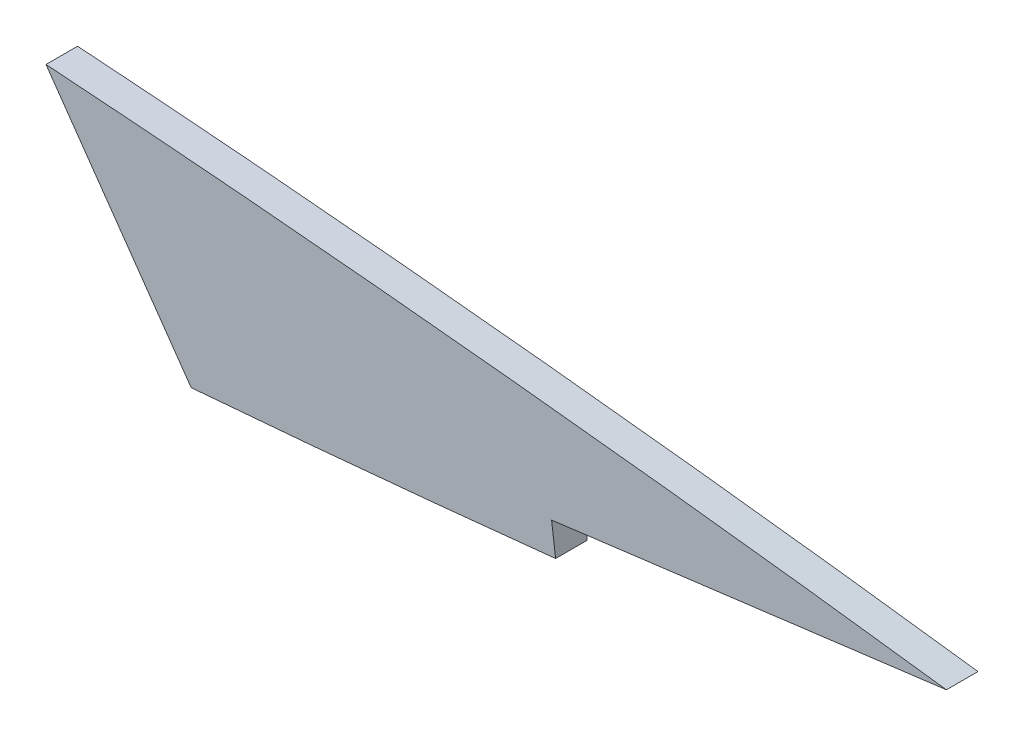
ISO-10303-21;
HEADER;
FILE_DESCRIPTION(('STEP AP214'),'2;1');
FILE_NAME('part.step','',(''),(''),'','','');
FILE_SCHEMA(('AUTOMOTIVE_DESIGN { 1 0 10303 214 1 1 1 1 }'));
ENDSEC;
DATA;
#1=APPLICATION_CONTEXT('core data for automotive mechanical design processes');
#2=APPLICATION_PROTOCOL_DEFINITION('international standard','automotive_design',2000,#1);
#3=PRODUCT_CONTEXT('',#1,'mechanical');
#4=PRODUCT('Part','Part','',(#3));
#5=PRODUCT_RELATED_PRODUCT_CATEGORY('part','',(#4));
#6=PRODUCT_DEFINITION_FORMATION('','',#4);
#7=PRODUCT_DEFINITION_CONTEXT('part definition',#1,'design');
#8=PRODUCT_DEFINITION('design','',#6,#7);
#9=PRODUCT_DEFINITION_SHAPE('','',#8);
#10=(LENGTH_UNIT() NAMED_UNIT(*) SI_UNIT(.MILLI.,.METRE.));
#11=(NAMED_UNIT(*) PLANE_ANGLE_UNIT() SI_UNIT($,.RADIAN.));
#12=(NAMED_UNIT(*) SI_UNIT($,.STERADIAN.) SOLID_ANGLE_UNIT());
#13=UNCERTAINTY_MEASURE_WITH_UNIT(LENGTH_MEASURE(1.E-05),#10,'distance_accuracy_value','');
#14=(GEOMETRIC_REPRESENTATION_CONTEXT(3) GLOBAL_UNCERTAINTY_ASSIGNED_CONTEXT((#13)) GLOBAL_UNIT_ASSIGNED_CONTEXT((#10,
#11,#12)) REPRESENTATION_CONTEXT('',''));
#15=CARTESIAN_POINT('',(0.,0.,0.));
#16=DIRECTION('',(0.,0.,1.));
#17=DIRECTION('',(1.,0.,0.));
#18=AXIS2_PLACEMENT_3D('',#15,#16,#17);
#19=CARTESIAN_POINT('',(0.,0.,3.175));
#20=CARTESIAN_POINT('',(0.0708566176245308,-0.503892135458456,3.175));
#21=CARTESIAN_POINT('',(0.222897844883801,-1.58512323637287,3.175));
#22=CARTESIAN_POINT('',(1.36213982950327,-3.03881296823146,3.175));
#23=CARTESIAN_POINT('',(3.04316497549499,-4.38312828719773,3.175));
#24=CARTESIAN_POINT('',(5.35946977445379,-5.65059123556018,3.175));
#25=CARTESIAN_POINT('',(8.27385898840015,-6.84370339426399,3.175));
#26=CARTESIAN_POINT('',(11.7890157512484,-7.95439279866021,3.175));
#27=CARTESIAN_POINT('',(15.8829450382519,-8.97231491952389,3.175));
#28=CARTESIAN_POINT('',(20.5337646150502,-9.88754374680108,3.175));
#29=CARTESIAN_POINT('',(25.7137677567996,-10.6897305438024,3.175));
#30=CARTESIAN_POINT('',(31.3917062626894,-11.3704971550494,3.175));
#31=CARTESIAN_POINT('',(37.5329276064113,-11.9240512642088,3.175));
#32=CARTESIAN_POINT('',(44.0998651231477,-12.3460695899735,3.175));
#33=CARTESIAN_POINT('',(51.0521542287944,-12.6352823070828,3.175));
#34=CARTESIAN_POINT('',(58.3470034111651,-12.7924459509203,3.175));
#35=CARTESIAN_POINT('',(65.9395092072841,-12.821544448045,3.175));
#36=CARTESIAN_POINT('',(73.7828619356442,-12.7281984084273,3.175));
#37=CARTESIAN_POINT('',(81.8288674116046,-12.5198158132498,3.175));
#38=CARTESIAN_POINT('',(90.0278029708368,-12.2065748576309,3.175));
#39=CARTESIAN_POINT('',(98.3293559746107,-11.7986946375634,3.175));
#40=CARTESIAN_POINT('',(106.682256297159,-11.307051658359,3.175));
#41=CARTESIAN_POINT('',(115.035081584936,-10.7440666608127,3.175));
#42=CARTESIAN_POINT('',(123.336366748146,-10.1215111728097,3.175));
#43=CARTESIAN_POINT('',(131.534856190804,-9.45094344354108,3.175));
#44=CARTESIAN_POINT('',(139.580173762397,-8.74329707077707,3.175));
#45=CARTESIAN_POINT('',(147.422629520458,-8.01040276449401,3.175));
#46=CARTESIAN_POINT('',(155.013925983715,-7.26188145307053,3.175));
#47=CARTESIAN_POINT('',(162.307240439106,-6.50824175648607,3.175));
#48=CARTESIAN_POINT('',(169.257621951007,-5.75920562373832,3.175));
#49=CARTESIAN_POINT('',(175.822180185659,-5.02409577647251,3.175));
#50=CARTESIAN_POINT('',(181.960384720361,-4.31182074276185,3.175));
#51=CARTESIAN_POINT('',(187.634552437271,-3.63230040522771,3.175));
#52=CARTESIAN_POINT('',(192.809425036358,-2.99323298474238,3.175));
#53=CARTESIAN_POINT('',(197.453852985459,-2.40560824501416,3.175));
#54=CARTESIAN_POINT('',(201.536874760313,-1.87241728832623,3.175));
#55=CARTESIAN_POINT('',(205.040435450561,-1.41681419446102,3.175));
#56=CARTESIAN_POINT('',(207.92222108872,-1.0023584594981,3.175));
#57=CARTESIAN_POINT('',(210.22045658255,-0.752231195334618,3.175));
#58=CARTESIAN_POINT('',(211.784320832651,-0.388103101507178,3.175));
#59=CARTESIAN_POINT('',(212.930217358513,-0.49847003041547,3.175));
#60=CARTESIAN_POINT('',(213.257272792978,-0.119144956230147,3.175));
#61=CARTESIAN_POINT('',(213.36,0.,3.175));
#62=B_SPLINE_CURVE_WITH_KNOTS('',3,(#19,#20,#21,#22,#23,#24,#25,#26,#27,#28,#29,#30,#31,#32,#33,
#34,#35,#36,#37,#38,#39,#40,#41,#42,#43,#44,#45,#46,#47,#48,#49,#50,#51,#52,#53,#54,#55,#56,#57,
#58,#59,#60,#61),.UNSPECIFIED.,.F.,.F.,(4,1,1,1,1,1,1,1,1,1,1,1,1,1,1,1,1,1,1,1,1,1,1,1,1,1,1,1,
1,1,1,1,1,1,1,1,1,1,1,1,4),(0.,0.00690887819095132,0.014824787780603,0.0245786747262124,
0.0365868011412138,0.0510270804082164,0.0679537271803132,0.0873481546665464,0.109150934661929,
0.133267944172764,0.159584673072264,0.187963463690011,0.218251704826384,0.250281930400473,
0.283870156733695,0.318821997747217,0.354933688380441,0.391987367731552,0.429762919657396,
0.468028540529623,0.506552783072523,0.545097780862577,0.583424682124698,0.621298850837664,
0.658483139040777,0.694749649104267,0.72987052691746,0.763629321442605,0.795816346106627,
0.826229711631338,0.85468110230924,0.880993609524026,0.90500122422466,0.92655519067439,
0.945518651994912,0.961773354231409,0.975215057817464,0.985759966117311,0.993340110835715,
0.997908147241042,1.),.UNSPECIFIED.);
#63=DIRECTION('',(0.,0.,-1.));
#64=VECTOR('',#63,1.);
#65=SURFACE_OF_LINEAR_EXTRUSION('',#62,#64);
#66=CARTESIAN_POINT('',(126.34817892125,-9.87236754167973,3.175));
#67=VERTEX_POINT('',#66);
#68=CARTESIAN_POINT('',(162.968963270263,-6.43299442734513,3.175));
#69=VERTEX_POINT('',#68);
#70=EDGE_CURVE('E94',#67,#69,#62,.T.);
#71=ORIENTED_EDGE('',*,*,#70,.F.);
#72=DIRECTION('',(0.,0.,1.));
#73=VECTOR('',#72,1.);
#74=CARTESIAN_POINT('',(126.34817892125,-9.87236754167973,-1.905));
#75=LINE('',#74,#73);
#76=CARTESIAN_POINT('',(126.34817892125,-9.87236754167973,0.));
#77=VERTEX_POINT('',#76);
#78=EDGE_CURVE('E80',#77,#67,#75,.T.);
#79=ORIENTED_EDGE('',*,*,#78,.F.);
#80=CARTESIAN_POINT('',(0.,0.,0.));
#81=CARTESIAN_POINT('',(0.0708566176245308,-0.503892135458456,0.));
#82=CARTESIAN_POINT('',(0.222897844883801,-1.58512323637287,0.));
#83=CARTESIAN_POINT('',(1.36213982950327,-3.03881296823146,0.));
#84=CARTESIAN_POINT('',(3.04316497549499,-4.38312828719773,0.));
#85=CARTESIAN_POINT('',(5.35946977445379,-5.65059123556018,0.));
#86=CARTESIAN_POINT('',(8.27385898840015,-6.84370339426399,0.));
#87=CARTESIAN_POINT('',(11.7890157512484,-7.95439279866021,0.));
#88=CARTESIAN_POINT('',(15.8829450382519,-8.97231491952389,0.));
#89=CARTESIAN_POINT('',(20.5337646150502,-9.88754374680108,0.));
#90=CARTESIAN_POINT('',(25.7137677567996,-10.6897305438024,0.));
#91=CARTESIAN_POINT('',(31.3917062626894,-11.3704971550494,0.));
#92=CARTESIAN_POINT('',(37.5329276064113,-11.9240512642088,0.));
#93=CARTESIAN_POINT('',(44.0998651231477,-12.3460695899735,0.));
#94=CARTESIAN_POINT('',(51.0521542287944,-12.6352823070828,0.));
#95=CARTESIAN_POINT('',(58.3470034111651,-12.7924459509203,0.));
#96=CARTESIAN_POINT('',(65.9395092072841,-12.821544448045,0.));
#97=CARTESIAN_POINT('',(73.7828619356442,-12.7281984084273,0.));
#98=CARTESIAN_POINT('',(81.8288674116046,-12.5198158132498,0.));
#99=CARTESIAN_POINT('',(90.0278029708368,-12.2065748576309,0.));
#100=CARTESIAN_POINT('',(98.3293559746107,-11.7986946375634,0.));
#101=CARTESIAN_POINT('',(106.682256297159,-11.307051658359,0.));
#102=CARTESIAN_POINT('',(115.035081584936,-10.7440666608127,0.));
#103=CARTESIAN_POINT('',(123.336366748146,-10.1215111728097,0.));
#104=CARTESIAN_POINT('',(131.534856190804,-9.45094344354108,0.));
#105=CARTESIAN_POINT('',(139.580173762397,-8.74329707077707,0.));
#106=CARTESIAN_POINT('',(147.422629520458,-8.01040276449401,0.));
#107=CARTESIAN_POINT('',(155.013925983715,-7.26188145307053,0.));
#108=CARTESIAN_POINT('',(162.307240439106,-6.50824175648607,0.));
#109=CARTESIAN_POINT('',(169.257621951007,-5.75920562373832,0.));
#110=CARTESIAN_POINT('',(175.822180185659,-5.02409577647251,0.));
#111=CARTESIAN_POINT('',(181.960384720361,-4.31182074276185,0.));
#112=CARTESIAN_POINT('',(187.634552437271,-3.63230040522771,0.));
#113=CARTESIAN_POINT('',(192.809425036358,-2.99323298474238,0.));
#114=CARTESIAN_POINT('',(197.453852985459,-2.40560824501416,0.));
#115=CARTESIAN_POINT('',(201.536874760313,-1.87241728832623,0.));
#116=CARTESIAN_POINT('',(205.040435450561,-1.41681419446102,0.));
#117=CARTESIAN_POINT('',(207.92222108872,-1.0023584594981,0.));
#118=CARTESIAN_POINT('',(210.22045658255,-0.752231195334618,0.));
#119=CARTESIAN_POINT('',(211.784320832651,-0.388103101507178,0.));
#120=CARTESIAN_POINT('',(212.930217358513,-0.49847003041547,0.));
#121=CARTESIAN_POINT('',(213.257272792978,-0.119144956230147,0.));
#122=CARTESIAN_POINT('',(213.36,0.,0.));
#123=B_SPLINE_CURVE_WITH_KNOTS('',3,(#80,#81,#82,#83,#84,#85,#86,#87,#88,#89,#90,#91,#92,#93,
#94,#95,#96,#97,#98,#99,#100,#101,#102,#103,#104,#105,#106,#107,#108,#109,#110,#111,#112,#113,
#114,#115,#116,#117,#118,#119,#120,#121,#122),.UNSPECIFIED.,.F.,.F.,(4,1,1,1,1,1,1,1,1,1,1,1,1,
1,1,1,1,1,1,1,1,1,1,1,1,1,1,1,1,1,1,1,1,1,1,1,1,1,1,1,4),(0.,0.00690887819095132,
0.014824787780603,0.0245786747262124,0.0365868011412138,0.0510270804082164,0.0679537271803132,
0.0873481546665464,0.109150934661929,0.133267944172764,0.159584673072264,0.187963463690011,
0.218251704826384,0.250281930400473,0.283870156733695,0.318821997747217,0.354933688380441,
0.391987367731552,0.429762919657396,0.468028540529623,0.506552783072523,0.545097780862577,
0.583424682124698,0.621298850837664,0.658483139040777,0.694749649104267,0.72987052691746,
0.763629321442605,0.795816346106627,0.826229711631338,0.85468110230924,0.880993609524026,
0.90500122422466,0.92655519067439,0.945518651994912,0.961773354231409,0.975215057817464,
0.985759966117311,0.993340110835715,0.997908147241042,1.),.UNSPECIFIED.);
#124=CARTESIAN_POINT('',(162.968963270263,-6.43299442734514,0.));
#125=VERTEX_POINT('',#124);
#126=EDGE_CURVE('E105',#77,#125,#123,.T.);
#127=ORIENTED_EDGE('',*,*,#126,.T.);
#128=DIRECTION('',(0.,0.,-1.));
#129=VECTOR('',#128,1.);
#130=CARTESIAN_POINT('',(162.968963270237,-6.4329944271416,3.175));
#131=LINE('',#130,#129);
#132=EDGE_CURVE('E100',#125,#69,#131,.F.);
#133=ORIENTED_EDGE('',*,*,#132,.T.);
#134=EDGE_LOOP('',(#71,#79,#127,#133));
#135=FACE_BOUND('',#134,.T.);
#136=ADVANCED_FACE('F36',(#135),#65,.F.);
#137=CARTESIAN_POINT('',(213.36,0.,3.175));
#138=CARTESIAN_POINT('',(213.257272792978,0.119144956230142,3.175));
#139=CARTESIAN_POINT('',(212.930217358512,0.498470030415466,3.175));
#140=CARTESIAN_POINT('',(211.784320832651,0.388103101507173,3.175));
#141=CARTESIAN_POINT('',(210.22045658255,0.752231195334613,3.175));
#142=CARTESIAN_POINT('',(207.92222108872,1.00235845949809,3.175));
#143=CARTESIAN_POINT('',(205.040435450562,1.41681419446102,3.175));
#144=CARTESIAN_POINT('',(201.536874760312,1.87241728832622,3.175));
#145=CARTESIAN_POINT('',(197.453852985459,2.40560824501415,3.175));
#146=CARTESIAN_POINT('',(192.809425036357,2.99323298474238,3.175));
#147=CARTESIAN_POINT('',(187.634552437271,3.63230040522771,3.175));
#148=CARTESIAN_POINT('',(181.960384720361,4.31182074276184,3.175));
#149=CARTESIAN_POINT('',(175.822180185659,5.02409577647251,3.175));
#150=CARTESIAN_POINT('',(169.257621951007,5.7592056237383,3.175));
#151=CARTESIAN_POINT('',(162.307240439105,6.50824175648606,3.175));
#152=CARTESIAN_POINT('',(155.013925983715,7.26188145307051,3.175));
#153=CARTESIAN_POINT('',(147.422629520457,8.010402764494,3.175));
#154=CARTESIAN_POINT('',(139.580173762397,8.74329707077704,3.175));
#155=CARTESIAN_POINT('',(131.534856190804,9.45094344354107,3.175));
#156=CARTESIAN_POINT('',(123.336366748146,10.1215111728097,3.175));
#157=CARTESIAN_POINT('',(115.035081584936,10.7440666608127,3.175));
#158=CARTESIAN_POINT('',(106.682256297158,11.307051658359,3.175));
#159=CARTESIAN_POINT('',(98.3293559746105,11.7986946375634,3.175));
#160=CARTESIAN_POINT('',(90.0278029708365,12.2065748576309,3.175));
#161=CARTESIAN_POINT('',(81.8288674116045,12.5198158132498,3.175));
#162=CARTESIAN_POINT('',(73.7828619356441,12.7281984084272,3.175));
#163=CARTESIAN_POINT('',(65.9395092072839,12.821544448045,3.175));
#164=CARTESIAN_POINT('',(58.347003411165,12.7924459509203,3.175));
#165=CARTESIAN_POINT('',(51.0521542287943,12.6352823070828,3.175));
#166=CARTESIAN_POINT('',(44.0998651231476,12.3460695899734,3.175));
#167=CARTESIAN_POINT('',(37.5329276064113,11.9240512642088,3.175));
#168=CARTESIAN_POINT('',(31.3917062626893,11.3704971550493,3.175));
#169=CARTESIAN_POINT('',(25.7137677567995,10.6897305438024,3.175));
#170=CARTESIAN_POINT('',(20.5337646150501,9.88754374680108,3.175));
#171=CARTESIAN_POINT('',(15.8829450382519,8.97231491952387,3.175));
#172=CARTESIAN_POINT('',(11.7890157512483,7.95439279866019,3.175));
#173=CARTESIAN_POINT('',(8.27385898840014,6.84370339426397,3.175));
#174=CARTESIAN_POINT('',(5.35946977445377,5.65059123556016,3.175));
#175=CARTESIAN_POINT('',(3.04316497549498,4.38312828719772,3.175));
#176=CARTESIAN_POINT('',(1.36213982950326,3.03881296823146,3.175));
#177=CARTESIAN_POINT('',(0.2228978448838,1.58512323637286,3.175));
#178=CARTESIAN_POINT('',(0.0708566176245304,0.503892135458448,3.175));
#179=CARTESIAN_POINT('',(0.,0.,3.175));
#180=B_SPLINE_CURVE_WITH_KNOTS('',3,(#137,#138,#139,#140,#141,#142,#143,#144,#145,#146,#147,
#148,#149,#150,#151,#152,#153,#154,#155,#156,#157,#158,#159,#160,#161,#162,#163,#164,#165,#166,
#167,#168,#169,#170,#171,#172,#173,#174,#175,#176,#177,#178,#179),.UNSPECIFIED.,.F.,.F.,(4,1,1,
1,1,1,1,1,1,1,1,1,1,1,1,1,1,1,1,1,1,1,1,1,1,1,1,1,1,1,1,1,1,1,1,1,1,1,1,1,4),(0.,
0.00209185275895771,0.00665988916428452,0.0142400338826894,0.0247849421825357,
0.0382266457685912,0.0544813480050881,0.0734448093256102,0.0949987757753401,0.119006390475974,
0.14531889769076,0.173770288368662,0.204183653893373,0.236370678557395,0.27012947308254,
0.305250350895733,0.341516860959223,0.378701149162336,0.416575317875302,0.454902219137423,
0.493447216927477,0.531971459470377,0.570237080342604,0.608012632268448,0.645066311619559,
0.681178002252783,0.716129843266305,0.749718069599527,0.781748295173616,0.812036536309989,
0.840415326927736,0.866732055827236,0.890849065338071,0.912651845333454,0.932046272819687,
0.948972919591784,0.963413198858786,0.975421325273788,0.985175212219397,0.993091121809049,1.),.UNSPECIFIED.);
#181=DIRECTION('',(0.,0.,-1.));
#182=VECTOR('',#181,1.);
#183=SURFACE_OF_LINEAR_EXTRUSION('',#180,#182);
#184=CARTESIAN_POINT('',(213.36,0.,0.));
#185=CARTESIAN_POINT('',(213.257272792978,0.119144956230142,0.));
#186=CARTESIAN_POINT('',(212.930217358512,0.498470030415466,0.));
#187=CARTESIAN_POINT('',(211.784320832651,0.388103101507173,0.));
#188=CARTESIAN_POINT('',(210.22045658255,0.752231195334613,0.));
#189=CARTESIAN_POINT('',(207.92222108872,1.00235845949809,0.));
#190=CARTESIAN_POINT('',(205.040435450562,1.41681419446102,0.));
#191=CARTESIAN_POINT('',(201.536874760312,1.87241728832622,0.));
#192=CARTESIAN_POINT('',(197.453852985459,2.40560824501415,0.));
#193=CARTESIAN_POINT('',(192.809425036357,2.99323298474238,0.));
#194=CARTESIAN_POINT('',(187.634552437271,3.63230040522771,0.));
#195=CARTESIAN_POINT('',(181.960384720361,4.31182074276184,0.));
#196=CARTESIAN_POINT('',(175.822180185659,5.02409577647251,0.));
#197=CARTESIAN_POINT('',(169.257621951007,5.7592056237383,0.));
#198=CARTESIAN_POINT('',(162.307240439105,6.50824175648606,0.));
#199=CARTESIAN_POINT('',(155.013925983715,7.26188145307051,0.));
#200=CARTESIAN_POINT('',(147.422629520457,8.010402764494,0.));
#201=CARTESIAN_POINT('',(139.580173762397,8.74329707077704,0.));
#202=CARTESIAN_POINT('',(131.534856190804,9.45094344354107,0.));
#203=CARTESIAN_POINT('',(123.336366748146,10.1215111728097,0.));
#204=CARTESIAN_POINT('',(115.035081584936,10.7440666608127,0.));
#205=CARTESIAN_POINT('',(106.682256297158,11.307051658359,0.));
#206=CARTESIAN_POINT('',(98.3293559746105,11.7986946375634,0.));
#207=CARTESIAN_POINT('',(90.0278029708365,12.2065748576309,0.));
#208=CARTESIAN_POINT('',(81.8288674116045,12.5198158132498,0.));
#209=CARTESIAN_POINT('',(73.7828619356441,12.7281984084272,0.));
#210=CARTESIAN_POINT('',(65.9395092072839,12.821544448045,0.));
#211=CARTESIAN_POINT('',(58.347003411165,12.7924459509203,0.));
#212=CARTESIAN_POINT('',(51.0521542287943,12.6352823070828,0.));
#213=CARTESIAN_POINT('',(44.0998651231476,12.3460695899734,0.));
#214=CARTESIAN_POINT('',(37.5329276064113,11.9240512642088,0.));
#215=CARTESIAN_POINT('',(31.3917062626893,11.3704971550493,0.));
#216=CARTESIAN_POINT('',(25.7137677567995,10.6897305438024,0.));
#217=CARTESIAN_POINT('',(20.5337646150501,9.88754374680108,0.));
#218=CARTESIAN_POINT('',(15.8829450382519,8.97231491952387,0.));
#219=CARTESIAN_POINT('',(11.7890157512483,7.95439279866019,0.));
#220=CARTESIAN_POINT('',(8.27385898840014,6.84370339426397,0.));
#221=CARTESIAN_POINT('',(5.35946977445377,5.65059123556016,0.));
#222=CARTESIAN_POINT('',(3.04316497549498,4.38312828719772,0.));
#223=CARTESIAN_POINT('',(1.36213982950326,3.03881296823146,0.));
#224=CARTESIAN_POINT('',(0.2228978448838,1.58512323637286,0.));
#225=CARTESIAN_POINT('',(0.0708566176245304,0.503892135458448,0.));
#226=CARTESIAN_POINT('',(0.,0.,0.));
#227=B_SPLINE_CURVE_WITH_KNOTS('',3,(#184,#185,#186,#187,#188,#189,#190,#191,#192,#193,#194,
#195,#196,#197,#198,#199,#200,#201,#202,#203,#204,#205,#206,#207,#208,#209,#210,#211,#212,#213,
#214,#215,#216,#217,#218,#219,#220,#221,#222,#223,#224,#225,#226),.UNSPECIFIED.,.F.,.F.,(4,1,1,
1,1,1,1,1,1,1,1,1,1,1,1,1,1,1,1,1,1,1,1,1,1,1,1,1,1,1,1,1,1,1,1,1,1,1,1,1,4),(0.,
0.00209185275895771,0.00665988916428452,0.0142400338826894,0.0247849421825357,
0.0382266457685912,0.0544813480050881,0.0734448093256102,0.0949987757753401,0.119006390475974,
0.14531889769076,0.173770288368662,0.204183653893373,0.236370678557395,0.27012947308254,
0.305250350895733,0.341516860959223,0.378701149162336,0.416575317875302,0.454902219137423,
0.493447216927477,0.531971459470377,0.570237080342604,0.608012632268448,0.645066311619559,
0.681178002252783,0.716129843266305,0.749718069599527,0.781748295173616,0.812036536309989,
0.840415326927736,0.866732055827236,0.890849065338071,0.912651845333454,0.932046272819687,
0.948972919591784,0.963413198858786,0.975421325273788,0.985175212219397,0.993091121809049,1.),.UNSPECIFIED.);
#228=CARTESIAN_POINT('',(202.239880602229,1.7811567236912,0.));
#229=VERTEX_POINT('',#228);
#230=CARTESIAN_POINT('',(111.759999999983,10.9617111067254,0.));
#231=VERTEX_POINT('',#230);
#232=EDGE_CURVE('E101',#229,#231,#227,.T.);
#233=ORIENTED_EDGE('',*,*,#232,.T.);
#234=DIRECTION('',(0.,0.,1.));
#235=VECTOR('',#234,1.);
#236=CARTESIAN_POINT('',(111.759999999983,10.9617111067254,-1.905));
#237=LINE('',#236,#235);
#238=CARTESIAN_POINT('',(111.759999999983,10.9617111067254,3.175));
#239=VERTEX_POINT('',#238);
#240=EDGE_CURVE('E59',#231,#239,#237,.T.);
#241=ORIENTED_EDGE('',*,*,#240,.T.);
#242=CARTESIAN_POINT('',(202.239880602229,1.7811567236912,3.175));
#243=VERTEX_POINT('',#242);
#244=EDGE_CURVE('E97',#243,#239,#180,.T.);
#245=ORIENTED_EDGE('',*,*,#244,.F.);
#246=DIRECTION('',(0.,0.,-1.));
#247=VECTOR('',#246,1.);
#248=CARTESIAN_POINT('',(202.239880602251,1.78115672369406,3.175));
#249=LINE('',#248,#247);
#250=EDGE_CURVE('E187',#243,#229,#249,.T.);
#251=ORIENTED_EDGE('',*,*,#250,.T.);
#252=EDGE_LOOP('',(#233,#241,#245,#251));
#253=FACE_BOUND('',#252,.T.);
#254=ADVANCED_FACE('F124',(#253),#183,.F.);
#255=CARTESIAN_POINT('',(105.256601766235,-11.384091769491,3.175));
#256=DIRECTION('',(0.,0.,1.));
#257=DIRECTION('',(1.,0.,0.));
#258=AXIS2_PLACEMENT_3D('',#255,#256,#257);
#259=PLANE('',#258);
#260=DIRECTION('',(-0.573576436351047,0.819152044288991,0.));
#261=VECTOR('',#260,1.);
#262=CARTESIAN_POINT('',(111.759999999983,10.9617111067254,3.175));
#263=LINE('',#262,#261);
#264=EDGE_CURVE('E83',#67,#239,#263,.T.);
#265=ORIENTED_EDGE('',*,*,#264,.F.);
#266=ORIENTED_EDGE('',*,*,#70,.T.);
#267=DIRECTION('',(0.126633748565781,-0.991949541924476,0.));
#268=VECTOR('',#267,1.);
#269=CARTESIAN_POINT('',(163.371025421933,-9.58243422275184,3.175));
#270=LINE('',#269,#268);
#271=CARTESIAN_POINT('',(162.56690111854,-3.28355463153137,3.175));
#272=VERTEX_POINT('',#271);
#273=EDGE_CURVE('E188',#272,#69,#270,.T.);
#274=ORIENTED_EDGE('',*,*,#273,.F.);
#275=DIRECTION('',(-0.991949541924477,-0.126633748565779,0.));
#276=VECTOR('',#275,1.);
#277=CARTESIAN_POINT('',(162.56690111854,-3.28355463153137,3.175));
#278=LINE('',#277,#276);
#279=EDGE_CURVE('E185',#243,#272,#278,.T.);
#280=ORIENTED_EDGE('',*,*,#279,.F.);
#281=ORIENTED_EDGE('',*,*,#244,.T.);
#282=EDGE_LOOP('',(#265,#266,#274,#280,#281));
#283=FACE_BOUND('',#282,.T.);
#284=ADVANCED_FACE('F92',(#283),#259,.T.);
#285=CARTESIAN_POINT('',(105.256601766235,-11.384091769491,0.));
#286=DIRECTION('',(0.,0.,1.));
#287=DIRECTION('',(1.,0.,0.));
#288=AXIS2_PLACEMENT_3D('',#285,#286,#287);
#289=PLANE('',#288);
#290=ORIENTED_EDGE('',*,*,#126,.F.);
#291=DIRECTION('',(-0.573576436351047,0.819152044288991,0.));
#292=VECTOR('',#291,1.);
#293=CARTESIAN_POINT('',(120.119540515273,-0.976950017465591,0.));
#294=LINE('',#293,#292);
#295=EDGE_CURVE('E11',#77,#231,#294,.T.);
#296=ORIENTED_EDGE('',*,*,#295,.T.);
#297=ORIENTED_EDGE('',*,*,#232,.F.);
#298=DIRECTION('',(-0.991949541924477,-0.126633748565779,0.));
#299=VECTOR('',#298,1.);
#300=CARTESIAN_POINT('',(105.158092605201,-10.6124482047215,0.));
#301=LINE('',#300,#299);
#302=CARTESIAN_POINT('',(162.56690111854,-3.28355463153137,0.));
#303=VERTEX_POINT('',#302);
#304=EDGE_CURVE('E102',#229,#303,#301,.T.);
#305=ORIENTED_EDGE('',*,*,#304,.T.);
#306=DIRECTION('',(0.126633748565781,-0.991949541924476,0.));
#307=VECTOR('',#306,1.);
#308=CARTESIAN_POINT('',(162.665410279575,-4.05519819630078,0.));
#309=LINE('',#308,#307);
#310=EDGE_CURVE('E44',#303,#125,#309,.T.);
#311=ORIENTED_EDGE('',*,*,#310,.T.);
#312=EDGE_LOOP('',(#290,#296,#297,#305,#311));
#313=FACE_BOUND('',#312,.T.);
#314=ADVANCED_FACE('F128',(#313),#289,.F.);
#315=CARTESIAN_POINT('',(163.371025421933,-9.58243422275184,-1.905));
#316=DIRECTION('',(-0.991949541924476,-0.126633748565781,0.));
#317=DIRECTION('',(0.126633748565781,-0.991949541924476,0.));
#318=AXIS2_PLACEMENT_3D('',#315,#316,#317);
#319=PLANE('',#318);
#320=ORIENTED_EDGE('',*,*,#310,.F.);
#321=DIRECTION('',(0.,0.,1.));
#322=VECTOR('',#321,1.);
#323=CARTESIAN_POINT('',(162.56690111854,-3.28355463153137,-1.905));
#324=LINE('',#323,#322);
#325=EDGE_CURVE('E51',#303,#272,#324,.T.);
#326=ORIENTED_EDGE('',*,*,#325,.T.);
#327=ORIENTED_EDGE('',*,*,#273,.T.);
#328=ORIENTED_EDGE('',*,*,#132,.F.);
#329=EDGE_LOOP('',(#320,#326,#327,#328));
#330=FACE_BOUND('',#329,.T.);
#331=ADVANCED_FACE('F131',(#330),#319,.F.);
#332=CARTESIAN_POINT('',(162.56690111854,-3.28355463153137,-1.905));
#333=DIRECTION('',(-0.126633748565779,0.991949541924477,0.));
#334=DIRECTION('',(-0.991949541924477,-0.126633748565779,0.));
#335=AXIS2_PLACEMENT_3D('',#332,#333,#334);
#336=PLANE('',#335);
#337=ORIENTED_EDGE('',*,*,#279,.T.);
#338=ORIENTED_EDGE('',*,*,#325,.F.);
#339=ORIENTED_EDGE('',*,*,#304,.F.);
#340=ORIENTED_EDGE('',*,*,#250,.F.);
#341=EDGE_LOOP('',(#337,#338,#339,#340));
#342=FACE_BOUND('',#341,.T.);
#343=ADVANCED_FACE('F137',(#342),#336,.F.);
#344=CARTESIAN_POINT('',(111.759999999983,10.9617111067254,-1.905));
#345=DIRECTION('',(0.819152044288991,0.573576436351047,0.));
#346=DIRECTION('',(-0.573576436351047,0.819152044288991,0.));
#347=AXIS2_PLACEMENT_3D('',#344,#345,#346);
#348=PLANE('',#347);
#349=ORIENTED_EDGE('',*,*,#78,.T.);
#350=ORIENTED_EDGE('',*,*,#264,.T.);
#351=ORIENTED_EDGE('',*,*,#240,.F.);
#352=ORIENTED_EDGE('',*,*,#295,.F.);
#353=EDGE_LOOP('',(#349,#350,#351,#352));
#354=FACE_BOUND('',#353,.T.);
#355=ADVANCED_FACE('F82',(#354),#348,.F.);
#356=CLOSED_SHELL('',(#136,#254,#284,#314,#331,#343,#355));
#357=MANIFOLD_SOLID_BREP('B2',#356);
#358=ADVANCED_BREP_SHAPE_REPRESENTATION('',(#18,#357),#14);
#359=SHAPE_DEFINITION_REPRESENTATION(#9,#358);
ENDSEC;
END-ISO-10303-21;
